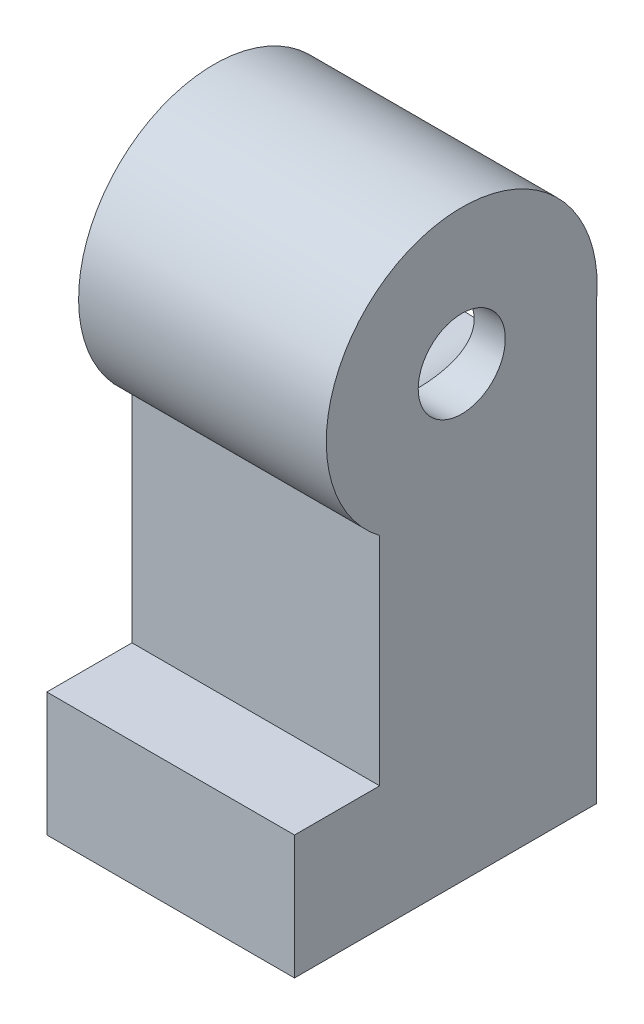
ISO-10303-21;
HEADER;
FILE_DESCRIPTION(('STEP AP214'),'2;1');
FILE_NAME('part.step','',(''),(''),'','','');
FILE_SCHEMA(('AUTOMOTIVE_DESIGN { 1 0 10303 214 1 1 1 1 }'));
ENDSEC;
DATA;
#1=APPLICATION_CONTEXT('core data for automotive mechanical design processes');
#2=APPLICATION_PROTOCOL_DEFINITION('international standard','automotive_design',2000,#1);
#3=PRODUCT_CONTEXT('',#1,'mechanical');
#4=PRODUCT('Part','Part','',(#3));
#5=PRODUCT_RELATED_PRODUCT_CATEGORY('part','',(#4));
#6=PRODUCT_DEFINITION_FORMATION('','',#4);
#7=PRODUCT_DEFINITION_CONTEXT('part definition',#1,'design');
#8=PRODUCT_DEFINITION('design','',#6,#7);
#9=PRODUCT_DEFINITION_SHAPE('','',#8);
#10=(LENGTH_UNIT() NAMED_UNIT(*) SI_UNIT(.MILLI.,.METRE.));
#11=(NAMED_UNIT(*) PLANE_ANGLE_UNIT() SI_UNIT($,.RADIAN.));
#12=(NAMED_UNIT(*) SI_UNIT($,.STERADIAN.) SOLID_ANGLE_UNIT());
#13=UNCERTAINTY_MEASURE_WITH_UNIT(LENGTH_MEASURE(1.E-05),#10,'distance_accuracy_value','');
#14=(GEOMETRIC_REPRESENTATION_CONTEXT(3) GLOBAL_UNCERTAINTY_ASSIGNED_CONTEXT((#13)) GLOBAL_UNIT_ASSIGNED_CONTEXT((#10,
#11,#12)) REPRESENTATION_CONTEXT('',''));
#15=CARTESIAN_POINT('',(0.,0.,0.));
#16=DIRECTION('',(0.,0.,1.));
#17=DIRECTION('',(1.,0.,0.));
#18=AXIS2_PLACEMENT_3D('',#15,#16,#17);
#19=CARTESIAN_POINT('',(6.4,0.,27.8));
#20=DIRECTION('',(0.,0.,-1.));
#21=DIRECTION('',(1.,0.,0.));
#22=AXIS2_PLACEMENT_3D('',#19,#20,#21);
#23=PLANE('',#22);
#24=DIRECTION('',(0.,1.,0.));
#25=VECTOR('',#24,1.);
#26=CARTESIAN_POINT('',(0.,0.,27.8));
#27=LINE('',#26,#25);
#28=CARTESIAN_POINT('',(0.,0.,27.8));
#29=VERTEX_POINT('',#28);
#30=CARTESIAN_POINT('',(0.,3.2,27.8));
#31=VERTEX_POINT('',#30);
#32=EDGE_CURVE('E222',#29,#31,#27,.T.);
#33=ORIENTED_EDGE('',*,*,#32,.F.);
#34=DIRECTION('',(-1.,0.,0.));
#35=VECTOR('',#34,1.);
#36=CARTESIAN_POINT('',(6.4,0.,27.8));
#37=LINE('',#36,#35);
#38=CARTESIAN_POINT('',(6.4,0.,27.8));
#39=VERTEX_POINT('',#38);
#40=EDGE_CURVE('E245',#39,#29,#37,.T.);
#41=ORIENTED_EDGE('',*,*,#40,.F.);
#42=DIRECTION('',(0.,1.,0.));
#43=VECTOR('',#42,1.);
#44=CARTESIAN_POINT('',(6.4,0.,27.8));
#45=LINE('',#44,#43);
#46=CARTESIAN_POINT('',(6.4,3.2,27.8));
#47=VERTEX_POINT('',#46);
#48=EDGE_CURVE('E227',#39,#47,#45,.T.);
#49=ORIENTED_EDGE('',*,*,#48,.T.);
#50=DIRECTION('',(-1.,0.,0.));
#51=VECTOR('',#50,1.);
#52=CARTESIAN_POINT('',(6.4,3.2,27.8));
#53=LINE('',#52,#51);
#54=EDGE_CURVE('E12',#47,#31,#53,.T.);
#55=ORIENTED_EDGE('',*,*,#54,.T.);
#56=EDGE_LOOP('',(#33,#41,#49,#55));
#57=FACE_BOUND('',#56,.T.);
#58=ADVANCED_FACE('F52',(#57),#23,.F.);
#59=CARTESIAN_POINT('',(6.4,3.2,27.8));
#60=DIRECTION('',(0.,-1.,0.));
#61=DIRECTION('',(0.,0.,1.));
#62=AXIS2_PLACEMENT_3D('',#59,#60,#61);
#63=PLANE('',#62);
#64=DIRECTION('',(0.,0.,-1.));
#65=VECTOR('',#64,1.);
#66=CARTESIAN_POINT('',(0.,3.2,27.8));
#67=LINE('',#66,#65);
#68=CARTESIAN_POINT('',(0.,3.2,25.6));
#69=VERTEX_POINT('',#68);
#70=EDGE_CURVE('E214',#31,#69,#67,.T.);
#71=ORIENTED_EDGE('',*,*,#70,.F.);
#72=ORIENTED_EDGE('',*,*,#54,.F.);
#73=DIRECTION('',(0.,0.,-1.));
#74=VECTOR('',#73,1.);
#75=CARTESIAN_POINT('',(6.4,3.2,27.8));
#76=LINE('',#75,#74);
#77=CARTESIAN_POINT('',(6.4,3.2,25.6));
#78=VERTEX_POINT('',#77);
#79=EDGE_CURVE('E272',#47,#78,#76,.T.);
#80=ORIENTED_EDGE('',*,*,#79,.T.);
#81=DIRECTION('',(-1.,0.,0.));
#82=VECTOR('',#81,1.);
#83=CARTESIAN_POINT('',(6.4,3.2,25.6));
#84=LINE('',#83,#82);
#85=EDGE_CURVE('E65',#78,#69,#84,.T.);
#86=ORIENTED_EDGE('',*,*,#85,.T.);
#87=EDGE_LOOP('',(#71,#72,#80,#86));
#88=FACE_BOUND('',#87,.T.);
#89=ADVANCED_FACE('F203',(#88),#63,.F.);
#90=CARTESIAN_POINT('',(6.4,3.2,25.6));
#91=DIRECTION('',(0.,0.,-1.));
#92=DIRECTION('',(0.,-1.,0.));
#93=AXIS2_PLACEMENT_3D('',#90,#91,#92);
#94=PLANE('',#93);
#95=DIRECTION('',(0.,1.,0.));
#96=VECTOR('',#95,1.);
#97=CARTESIAN_POINT('',(0.,3.2,25.6));
#98=LINE('',#97,#96);
#99=CARTESIAN_POINT('',(0.,8.8,25.6));
#100=VERTEX_POINT('',#99);
#101=EDGE_CURVE('E221',#69,#100,#98,.T.);
#102=ORIENTED_EDGE('',*,*,#101,.F.);
#103=ORIENTED_EDGE('',*,*,#85,.F.);
#104=DIRECTION('',(0.,1.,0.));
#105=VECTOR('',#104,1.);
#106=CARTESIAN_POINT('',(6.4,3.2,25.6));
#107=LINE('',#106,#105);
#108=CARTESIAN_POINT('',(6.4,8.8,25.6));
#109=VERTEX_POINT('',#108);
#110=EDGE_CURVE('E259',#78,#109,#107,.T.);
#111=ORIENTED_EDGE('',*,*,#110,.T.);
#112=DIRECTION('',(-1.,0.,0.));
#113=VECTOR('',#112,1.);
#114=CARTESIAN_POINT('',(6.4,8.8,25.6));
#115=LINE('',#114,#113);
#116=EDGE_CURVE('E254',#109,#100,#115,.T.);
#117=ORIENTED_EDGE('',*,*,#116,.T.);
#118=EDGE_LOOP('',(#102,#103,#111,#117));
#119=FACE_BOUND('',#118,.T.);
#120=ADVANCED_FACE('F199',(#119),#94,.F.);
#121=CARTESIAN_POINT('',(6.4,11.5840258618578,23.4788682265105));
#122=DIRECTION('',(-1.,0.,0.));
#123=DIRECTION('',(0.,0.,-1.));
#124=AXIS2_PLACEMENT_3D('',#121,#122,#123);
#125=CYLINDRICAL_SURFACE('',#124,3.5);
#126=DIRECTION('',(-1.,0.,0.));
#127=VECTOR('',#126,1.);
#128=CARTESIAN_POINT('',(6.4,11.2,20.));
#129=LINE('',#128,#127);
#130=CARTESIAN_POINT('',(0.852661081138903,11.2,20.));
#131=VERTEX_POINT('',#130);
#132=CARTESIAN_POINT('',(0.,11.2,20.));
#133=VERTEX_POINT('',#132);
#134=EDGE_CURVE('E250',#131,#133,#129,.T.);
#135=ORIENTED_EDGE('',*,*,#134,.T.);
#136=CARTESIAN_POINT('',(0.,11.5840258618578,23.4788682265105));
#137=DIRECTION('',(-1.,0.,0.));
#138=DIRECTION('',(0.,0.,1.));
#139=AXIS2_PLACEMENT_3D('',#136,#137,#138);
#140=CIRCLE('',#139,3.5);
#141=EDGE_CURVE('E239',#100,#133,#140,.T.);
#142=ORIENTED_EDGE('',*,*,#141,.F.);
#143=ORIENTED_EDGE('',*,*,#116,.F.);
#144=CARTESIAN_POINT('',(6.4,11.5840258618578,23.4788682265105));
#145=DIRECTION('',(-1.,0.,0.));
#146=DIRECTION('',(0.,0.,1.));
#147=AXIS2_PLACEMENT_3D('',#144,#145,#146);
#148=CIRCLE('',#147,3.5);
#149=CARTESIAN_POINT('',(6.4,11.2,20.));
#150=VERTEX_POINT('',#149);
#151=EDGE_CURVE('E276',#109,#150,#148,.T.);
#152=ORIENTED_EDGE('',*,*,#151,.T.);
#153=CARTESIAN_POINT('',(5.5473389188611,11.2,20.));
#154=VERTEX_POINT('',#153);
#155=EDGE_CURVE('E251',#150,#154,#129,.T.);
#156=ORIENTED_EDGE('',*,*,#155,.T.);
#157=CARTESIAN_POINT('',(0.852661081138903,11.2,20.));
#158=CARTESIAN_POINT('',(0.840792293346237,11.2556738277083,19.9938438134975));
#159=CARTESIAN_POINT('',(0.830892766927941,11.3119160095123,19.9889984058087));
#160=CARTESIAN_POINT('',(0.815110303502944,11.4251260777878,19.9820198838566));
#161=CARTESIAN_POINT('',(0.809227320363557,11.4820939559166,19.979886738441));
#162=CARTESIAN_POINT('',(0.80157104908777,11.5961176248204,19.9784262527192));
#163=CARTESIAN_POINT('',(0.799781445972068,11.6531721564266,19.9790877436915));
#164=CARTESIAN_POINT('',(0.800261552975997,11.7671450125878,19.9831957472816));
#165=CARTESIAN_POINT('',(0.802531011672886,11.8240633453604,19.9866420873957));
#166=CARTESIAN_POINT('',(0.815380909087971,11.9940544139057,20.001116349994));
#167=CARTESIAN_POINT('',(0.832000500817748,12.10639939998,20.0162790810086));
#168=CARTESIAN_POINT('',(0.880312547670731,12.3258753161952,20.0565651958183));
#169=CARTESIAN_POINT('',(0.912013416300616,12.4330032990667,20.0816941382362));
#170=CARTESIAN_POINT('',(0.989988504379228,12.6427122302376,20.1409975856636));
#171=CARTESIAN_POINT('',(1.03664120934427,12.7450857404032,20.1754028505256));
#172=CARTESIAN_POINT('',(1.14244402315444,12.9404948285297,20.2507144673552));
#173=CARTESIAN_POINT('',(1.20159765209792,13.0335277653988,20.2916226496546));
#174=CARTESIAN_POINT('',(1.34142019627974,13.2237448020704,20.3846357282459));
#175=CARTESIAN_POINT('',(1.42402381716511,13.3191411164894,20.4374793988586));
#176=CARTESIAN_POINT('',(1.6026286577345,13.4956102104736,20.5451769699699));
#177=CARTESIAN_POINT('',(1.69865991915841,13.5766499219027,20.6000351688464));
#178=CARTESIAN_POINT('',(1.86002813647221,13.6924280478097,20.6846924784101));
#179=CARTESIAN_POINT('',(1.92128804897133,13.7323050685919,20.7153273261498));
#180=CARTESIAN_POINT('',(2.04784784601227,13.8066440389178,20.7747536818376));
#181=CARTESIAN_POINT('',(2.1131490474489,13.8411042102392,20.8035445826317));
#182=CARTESIAN_POINT('',(2.31463157585771,13.9356202222924,20.8852431757694));
#183=CARTESIAN_POINT('',(2.4569681619758,13.9872308836361,20.9338004468208));
#184=CARTESIAN_POINT('',(2.69816643388576,14.0488934090757,20.9938033781543));
#185=CARTESIAN_POINT('',(2.79317022247037,14.0672782999088,21.0123388545372));
#186=CARTESIAN_POINT('',(2.98617258953903,14.092425975245,21.0379130326297));
#187=CARTESIAN_POINT('',(3.08416572381198,14.0992087375294,21.0449714956457));
#188=CARTESIAN_POINT('',(3.28054729705155,14.1006615605423,21.0464725445557));
#189=CARTESIAN_POINT('',(3.37893613355414,14.0953058590704,21.0408882980851));
#190=CARTESIAN_POINT('',(3.57301216932402,14.0728544934742,21.017979545314));
#191=CARTESIAN_POINT('',(3.66869540391411,14.0557424450877,21.000638654782));
#192=CARTESIAN_POINT('',(3.88078763205757,14.0046634203404,20.9506083737128));
#193=CARTESIAN_POINT('',(3.99569201112349,13.967362907782,20.9150153866289));
#194=CARTESIAN_POINT('',(4.21592733276386,13.877638288311,20.8344446136202));
#195=CARTESIAN_POINT('',(4.32123614921084,13.8251803359318,20.7894458882553));
#196=CARTESIAN_POINT('',(4.547718440401,13.6912714191813,20.6826918787694));
#197=CARTESIAN_POINT('',(4.66591506819168,13.6058291996055,20.6196188679842));
#198=CARTESIAN_POINT('',(4.88519572570754,13.4150133540185,20.4938038611688));
#199=CARTESIAN_POINT('',(4.98626798994013,13.3096261289623,20.431062121187));
#200=CARTESIAN_POINT('',(5.16946333606693,13.0794342401466,20.3117645950617));
#201=CARTESIAN_POINT('',(5.25152283052074,12.9545666899694,20.2552298905018));
#202=CARTESIAN_POINT('',(5.35708199023806,12.7548307560407,20.1797318448857));
#203=CARTESIAN_POINT('',(5.3893322261386,12.6862257266232,20.1561281715822));
#204=CARTESIAN_POINT('',(5.44751416759658,12.545274773158,20.1126487843578));
#205=CARTESIAN_POINT('',(5.47344870231844,12.4729305417842,20.0927714021396));
#206=CARTESIAN_POINT('',(5.52849534527345,12.292090667837,20.0494814483499));
#207=CARTESIAN_POINT('',(5.55387766967909,12.1818451350743,20.0284377096837));
#208=CARTESIAN_POINT('',(5.58884557576572,11.9574628249701,19.9970075367504));
#209=CARTESIAN_POINT('',(5.59844568859202,11.8433297259872,19.9866113023433));
#210=CARTESIAN_POINT('',(5.60089727934255,11.6400881888514,19.978186374789));
#211=CARTESIAN_POINT('',(5.59701929540537,11.5511021001347,19.9779086599021));
#212=CARTESIAN_POINT('',(5.58385360655739,11.4185367026676,19.9825019246715));
#213=CARTESIAN_POINT('',(5.57823387307489,11.3744706000077,19.9848713355362));
#214=CARTESIAN_POINT('',(5.56458362295902,11.286826347634,19.9912320995191));
#215=CARTESIAN_POINT('',(5.55655284918177,11.2432482504818,19.9952236256563));
#216=CARTESIAN_POINT('',(5.5473389188611,11.2,20.));
#217=B_SPLINE_CURVE_WITH_KNOTS('',3,(#157,#158,#159,#160,#161,#162,#163,#164,#165,#166,#167,
#168,#169,#170,#171,#172,#173,#174,#175,#176,#177,#178,#179,#180,#181,#182,#183,#184,#185,#186,
#187,#188,#189,#190,#191,#192,#193,#194,#195,#196,#197,#198,#199,#200,#201,#202,#203,#204,#205,
#206,#207,#208,#209,#210,#211,#212,#213,#214,#215,#216),.UNSPECIFIED.,.F.,.F.,(4,2,2,2,2,2,2,2,
2,2,2,2,2,2,2,2,2,2,2,2,2,2,2,2,2,2,2,2,2,4),(0.,0.171723989401013,0.343446006403999,
0.514482389563074,0.685508178907873,1.02745241853051,1.36958764528835,1.72117673045833,
2.0728649507947,2.48177927619536,2.89162355912204,3.12909781536246,3.36664986665492,
3.83943681847953,4.13385152491645,4.42775876449654,4.72229036527191,5.01723327563622,
5.3929901520559,5.76959263754877,6.24394486008456,6.71862168168708,7.19486383484634,
7.4326922845584,7.67041400049624,8.01401878203673,8.35730701902312,8.62368382073456,
8.75705540094371,8.89044121064439),.UNSPECIFIED.);
#218=EDGE_CURVE('E181',#131,#154,#217,.T.);
#219=ORIENTED_EDGE('',*,*,#218,.F.);
#220=EDGE_LOOP('',(#135,#142,#143,#152,#156,#219));
#221=FACE_BOUND('',#220,.T.);
#222=ADVANCED_FACE('F193',(#221),#125,.T.);
#223=CARTESIAN_POINT('',(6.4,11.2,20.));
#224=DIRECTION('',(0.,0.,1.));
#225=DIRECTION('',(0.,1.,0.));
#226=AXIS2_PLACEMENT_3D('',#223,#224,#225);
#227=PLANE('',#226);
#228=ORIENTED_EDGE('',*,*,#155,.F.);
#229=DIRECTION('',(0.,-1.,0.));
#230=VECTOR('',#229,1.);
#231=CARTESIAN_POINT('',(6.4,11.2,20.));
#232=LINE('',#231,#230);
#233=CARTESIAN_POINT('',(6.4,0.,20.));
#234=VERTEX_POINT('',#233);
#235=EDGE_CURVE('E267',#150,#234,#232,.T.);
#236=ORIENTED_EDGE('',*,*,#235,.T.);
#237=DIRECTION('',(-1.,0.,0.));
#238=VECTOR('',#237,1.);
#239=CARTESIAN_POINT('',(6.4,0.,20.));
#240=LINE('',#239,#238);
#241=CARTESIAN_POINT('',(0.,0.,20.));
#242=VERTEX_POINT('',#241);
#243=EDGE_CURVE('E247',#234,#242,#240,.T.);
#244=ORIENTED_EDGE('',*,*,#243,.T.);
#245=DIRECTION('',(0.,-1.,0.));
#246=VECTOR('',#245,1.);
#247=CARTESIAN_POINT('',(0.,11.2,20.));
#248=LINE('',#247,#246);
#249=EDGE_CURVE('E242',#133,#242,#248,.T.);
#250=ORIENTED_EDGE('',*,*,#249,.F.);
#251=ORIENTED_EDGE('',*,*,#134,.F.);
#252=CARTESIAN_POINT('',(3.2,11.7,20.));
#253=DIRECTION('',(0.,0.,-1.));
#254=DIRECTION('',(0.,1.,0.));
#255=AXIS2_PLACEMENT_3D('',#252,#253,#254);
#256=CIRCLE('',#255,2.4);
#257=EDGE_CURVE('E79',#154,#131,#256,.T.);
#258=ORIENTED_EDGE('',*,*,#257,.F.);
#259=EDGE_LOOP('',(#228,#236,#244,#250,#251,#258));
#260=FACE_BOUND('',#259,.T.);
#261=ADVANCED_FACE('F198',(#260),#227,.F.);
#262=CARTESIAN_POINT('',(6.4,0.,20.));
#263=DIRECTION('',(0.,1.,0.));
#264=DIRECTION('',(0.,0.,-1.));
#265=AXIS2_PLACEMENT_3D('',#262,#263,#264);
#266=PLANE('',#265);
#267=DIRECTION('',(1.,0.,0.));
#268=VECTOR('',#267,1.);
#269=CARTESIAN_POINT('',(5.6,0.,24.7));
#270=LINE('',#269,#268);
#271=CARTESIAN_POINT('',(0.8,0.,24.7));
#272=VERTEX_POINT('',#271);
#273=CARTESIAN_POINT('',(5.6,0.,24.7));
#274=VERTEX_POINT('',#273);
#275=EDGE_CURVE('E154',#272,#274,#270,.T.);
#276=ORIENTED_EDGE('',*,*,#275,.T.);
#277=DIRECTION('',(0.,0.,-1.));
#278=VECTOR('',#277,1.);
#279=CARTESIAN_POINT('',(5.6,0.,21.4));
#280=LINE('',#279,#278);
#281=CARTESIAN_POINT('',(5.6,0.,21.4));
#282=VERTEX_POINT('',#281);
#283=EDGE_CURVE('E163',#274,#282,#280,.T.);
#284=ORIENTED_EDGE('',*,*,#283,.T.);
#285=DIRECTION('',(-1.,0.,0.));
#286=VECTOR('',#285,1.);
#287=CARTESIAN_POINT('',(5.6,0.,21.4));
#288=LINE('',#287,#286);
#289=CARTESIAN_POINT('',(0.8,0.,21.4));
#290=VERTEX_POINT('',#289);
#291=EDGE_CURVE('E160',#282,#290,#288,.T.);
#292=ORIENTED_EDGE('',*,*,#291,.T.);
#293=DIRECTION('',(0.,0.,1.));
#294=VECTOR('',#293,1.);
#295=CARTESIAN_POINT('',(0.8,0.,21.4));
#296=LINE('',#295,#294);
#297=EDGE_CURVE('E168',#290,#272,#296,.T.);
#298=ORIENTED_EDGE('',*,*,#297,.T.);
#299=EDGE_LOOP('',(#276,#284,#292,#298));
#300=FACE_BOUND('',#299,.T.);
#301=DIRECTION('',(0.,0.,1.));
#302=VECTOR('',#301,1.);
#303=CARTESIAN_POINT('',(0.,0.,20.));
#304=LINE('',#303,#302);
#305=EDGE_CURVE('E230',#242,#29,#304,.T.);
#306=ORIENTED_EDGE('',*,*,#305,.F.);
#307=ORIENTED_EDGE('',*,*,#243,.F.);
#308=DIRECTION('',(0.,0.,1.));
#309=VECTOR('',#308,1.);
#310=CARTESIAN_POINT('',(6.4,0.,20.));
#311=LINE('',#310,#309);
#312=EDGE_CURVE('E235',#234,#39,#311,.T.);
#313=ORIENTED_EDGE('',*,*,#312,.T.);
#314=ORIENTED_EDGE('',*,*,#40,.T.);
#315=EDGE_LOOP('',(#306,#307,#313,#314));
#316=FACE_BOUND('',#315,.T.);
#317=ADVANCED_FACE('F269',(#300,#316),#266,.F.);
#318=CARTESIAN_POINT('',(6.4,11.5840258618578,23.4788682265105));
#319=DIRECTION('',(1.,0.,0.));
#320=DIRECTION('',(0.,0.,1.));
#321=AXIS2_PLACEMENT_3D('',#318,#319,#320);
#322=PLANE('',#321);
#323=CARTESIAN_POINT('',(6.4,11.5840258618578,23.4788682265105));
#324=DIRECTION('',(-1.,0.,0.));
#325=DIRECTION('',(0.,0.,1.));
#326=AXIS2_PLACEMENT_3D('',#323,#324,#325);
#327=CIRCLE('',#326,1.125);
#328=CARTESIAN_POINT('',(6.4,11.5840258618578,24.6038682265105));
#329=VERTEX_POINT('',#328);
#330=EDGE_CURVE('E188',#329,#329,#327,.T.);
#331=ORIENTED_EDGE('',*,*,#330,.T.);
#332=EDGE_LOOP('',(#331));
#333=FACE_BOUND('',#332,.T.);
#334=ORIENTED_EDGE('',*,*,#48,.F.);
#335=ORIENTED_EDGE('',*,*,#312,.F.);
#336=ORIENTED_EDGE('',*,*,#235,.F.);
#337=ORIENTED_EDGE('',*,*,#151,.F.);
#338=ORIENTED_EDGE('',*,*,#110,.F.);
#339=ORIENTED_EDGE('',*,*,#79,.F.);
#340=EDGE_LOOP('',(#334,#335,#336,#337,#338,#339));
#341=FACE_BOUND('',#340,.T.);
#342=ADVANCED_FACE('F271',(#333,#341),#322,.T.);
#343=CARTESIAN_POINT('',(0.,11.5840258618578,23.4788682265105));
#344=DIRECTION('',(1.,0.,0.));
#345=DIRECTION('',(0.,0.,1.));
#346=AXIS2_PLACEMENT_3D('',#343,#344,#345);
#347=PLANE('',#346);
#348=ORIENTED_EDGE('',*,*,#32,.T.);
#349=ORIENTED_EDGE('',*,*,#70,.T.);
#350=ORIENTED_EDGE('',*,*,#101,.T.);
#351=ORIENTED_EDGE('',*,*,#141,.T.);
#352=ORIENTED_EDGE('',*,*,#249,.T.);
#353=ORIENTED_EDGE('',*,*,#305,.T.);
#354=EDGE_LOOP('',(#348,#349,#350,#351,#352,#353));
#355=FACE_BOUND('',#354,.T.);
#356=ADVANCED_FACE('F228',(#355),#347,.F.);
#357=CARTESIAN_POINT('',(4.4,11.5840258618578,23.4788682265105));
#358=DIRECTION('',(1.,0.,0.));
#359=DIRECTION('',(0.,0.,1.));
#360=AXIS2_PLACEMENT_3D('',#357,#358,#359);
#361=CYLINDRICAL_SURFACE('',#360,1.125);
#362=CARTESIAN_POINT('',(5.59719627883955,11.5840258618578,24.6038682265105));
#363=CARTESIAN_POINT('',(5.59427503568601,11.5236998748837,24.6038650365335));
#364=CARTESIAN_POINT('',(5.58905210179077,11.4633954270214,24.5989867097571));
#365=CARTESIAN_POINT('',(5.5743218710308,11.3447697342202,24.5797814246618));
#366=CARTESIAN_POINT('',(5.5648041855985,11.2864536690491,24.5654315163713));
#367=CARTESIAN_POINT('',(5.54228406811998,11.1736951561263,24.5280421764379));
#368=CARTESIAN_POINT('',(5.52929672890404,11.1192371939856,24.5050402081286));
#369=CARTESIAN_POINT('',(5.50083622660623,11.0151132443282,24.4511860875149));
#370=CARTESIAN_POINT('',(5.48536360297121,10.9654462206436,24.4203356379272));
#371=CARTESIAN_POINT('',(5.4520386656732,10.8686702833571,24.3493421252989));
#372=CARTESIAN_POINT('',(5.43409688153176,10.8219415538139,24.3087230165957));
#373=CARTESIAN_POINT('',(5.39825553474991,10.7357088414585,24.2203528545939));
#374=CARTESIAN_POINT('',(5.38035601851617,10.6962107858982,24.1725960079551));
#375=CARTESIAN_POINT('',(5.34521763397803,10.6230636219626,24.0675358381072));
#376=CARTESIAN_POINT('',(5.32809425961864,10.5899502462235,24.0098172734337));
#377=CARTESIAN_POINT('',(5.29804866437329,10.534150817495,23.8885390395374));
#378=CARTESIAN_POINT('',(5.28512215297769,10.5114541055265,23.8249854214026));
#379=CARTESIAN_POINT('',(5.26631700618769,10.4790740457501,23.6992506968597));
#380=CARTESIAN_POINT('',(5.25994977852162,10.4684807689214,23.6373799634428));
#381=CARTESIAN_POINT('',(5.25352047931649,10.4577847210202,23.5124358953973));
#382=CARTESIAN_POINT('',(5.25345254542066,10.45767219617,23.4493637335516));
#383=CARTESIAN_POINT('',(5.2592269212396,10.4672781823903,23.3321516702075));
#384=CARTESIAN_POINT('',(5.2643413488661,10.475785934956,23.2778695045071));
#385=CARTESIAN_POINT('',(5.27874926023561,10.5004153506345,23.1716429254855));
#386=CARTESIAN_POINT('',(5.28804408308577,10.5165394535782,23.1196992671292));
#387=CARTESIAN_POINT('',(5.31016714836939,10.5564403962688,23.0175633474632));
#388=CARTESIAN_POINT('',(5.32310400655172,10.5804570370807,22.9674892728388));
#389=CARTESIAN_POINT('',(5.35110322632575,10.6352461585047,22.8718397286599));
#390=CARTESIAN_POINT('',(5.36616656494112,10.6660217481871,22.8262663434234));
#391=CARTESIAN_POINT('',(5.39929507882386,10.7382905630724,22.7344095515959));
#392=CARTESIAN_POINT('',(5.41749021836008,10.7806714573843,22.6888690193456));
#393=CARTESIAN_POINT('',(5.45336321422796,10.8724829319528,22.6052610895203));
#394=CARTESIAN_POINT('',(5.47104078922944,10.9219172635145,22.5671976943589));
#395=CARTESIAN_POINT('',(5.50528502811888,11.0298938197844,22.4975858325427));
#396=CARTESIAN_POINT('',(5.52173233805914,11.0887930105403,22.4665275107757));
#397=CARTESIAN_POINT('',(5.55070633543802,11.2119723202044,22.4150792921436));
#398=CARTESIAN_POINT('',(5.56323577909977,11.2762486157807,22.394681888497));
#399=CARTESIAN_POINT('',(5.58237231342718,11.4031758018193,22.3667464010935));
#400=CARTESIAN_POINT('',(5.58935653683527,11.4655801693979,22.3583502718614));
#401=CARTESIAN_POINT('',(5.59836111641309,11.591258526578,22.3521363800897));
#402=CARTESIAN_POINT('',(5.60038411183566,11.6545320357932,22.354312991271));
#403=CARTESIAN_POINT('',(5.59952991305004,11.7746255372717,22.3686193174094));
#404=CARTESIAN_POINT('',(5.59704030805388,11.8315498012826,22.3799196498094));
#405=CARTESIAN_POINT('',(5.58834604163984,11.9427194663538,22.4110218684017));
#406=CARTESIAN_POINT('',(5.58214115103642,11.9969647019288,22.4308242790419));
#407=CARTESIAN_POINT('',(5.56666713397811,12.10219232262,22.4786095459337));
#408=CARTESIAN_POINT('',(5.5573551570658,12.1531164541508,22.506706126305));
#409=CARTESIAN_POINT('',(5.53670746560008,12.2497674361553,22.5701556571529));
#410=CARTESIAN_POINT('',(5.52537098197962,12.2954923006962,22.6055113659846));
#411=CARTESIAN_POINT('',(5.50087785208001,12.3842866806517,22.6857312873225));
#412=CARTESIAN_POINT('',(5.48764815131561,12.4268555406099,22.7311281891098));
#413=CARTESIAN_POINT('',(5.46168375686181,12.5040197628241,22.8284119156251));
#414=CARTESIAN_POINT('',(5.44894927497159,12.5386117439773,22.8803014780286));
#415=CARTESIAN_POINT('',(5.42508777705157,12.6000642633892,22.9915503733329));
#416=CARTESIAN_POINT('',(5.41404059567096,12.6265795985655,23.0511191237613));
#417=CARTESIAN_POINT('',(5.39580201317701,12.6690174451843,23.1744623437716));
#418=CARTESIAN_POINT('',(5.38860754691541,12.6849483798144,23.2382334245553));
#419=CARTESIAN_POINT('',(5.37957648705086,12.7047673604224,23.3635128732865));
#420=CARTESIAN_POINT('',(5.37740783442703,12.7094028928169,23.4248787740563));
#421=CARTESIAN_POINT('',(5.37777988888969,12.7086010452623,23.5475217261634));
#422=CARTESIAN_POINT('',(5.38031939967739,12.7031662240929,23.6087987961126));
#423=CARTESIAN_POINT('',(5.38942483237971,12.6831209082167,23.725692874231));
#424=CARTESIAN_POINT('',(5.39574067475723,12.6690790503203,23.7814291403855));
#425=CARTESIAN_POINT('',(5.41136734023517,12.6328670435783,23.8897460402496));
#426=CARTESIAN_POINT('',(5.42067901428647,12.6106945850262,23.9423257723203));
#427=CARTESIAN_POINT('',(5.44178944182351,12.5574618731686,24.0459885165314));
#428=CARTESIAN_POINT('',(5.45369596682053,12.5259836039807,24.0968343529843));
#429=CARTESIAN_POINT('',(5.47829179345431,12.4554989092288,24.1928062909083));
#430=CARTESIAN_POINT('',(5.49098140263382,12.4164895129781,24.2379301236338));
#431=CARTESIAN_POINT('',(5.51674285951374,12.3284596493027,24.3247721552222));
#432=CARTESIAN_POINT('',(5.52976870919507,12.2788991238743,24.3659593057808));
#433=CARTESIAN_POINT('',(5.5535389551452,12.1730653810064,24.4394968144208));
#434=CARTESIAN_POINT('',(5.564282626037,12.1167900381513,24.4718443638204));
#435=CARTESIAN_POINT('',(5.58186521955255,12.0002051240753,24.5259920896947));
#436=CARTESIAN_POINT('',(5.58877847366114,11.939999715173,24.5479916964591));
#437=CARTESIAN_POINT('',(5.59796539261416,11.8164877238476,24.5814361510914));
#438=CARTESIAN_POINT('',(5.60025232450305,11.7531905439682,24.5929111288778));
#439=CARTESIAN_POINT('',(5.59990121522555,11.6719595979114,24.6005658674204));
#440=CARTESIAN_POINT('',(5.59963107056676,11.6543894823292,24.6018036579469));
#441=CARTESIAN_POINT('',(5.59870464816884,11.6192209203101,24.6034552900255));
#442=CARTESIAN_POINT('',(5.59804838234512,11.6016224747641,24.6038691570015));
#443=CARTESIAN_POINT('',(5.59719627883955,11.5840258618578,24.6038682265105));
#444=B_SPLINE_CURVE_WITH_KNOTS('',3,(#362,#363,#364,#365,#366,#367,#368,#369,#370,#371,#372,
#373,#374,#375,#376,#377,#378,#379,#380,#381,#382,#383,#384,#385,#386,#387,#388,#389,#390,#391,
#392,#393,#394,#395,#396,#397,#398,#399,#400,#401,#402,#403,#404,#405,#406,#407,#408,#409,#410,
#411,#412,#413,#414,#415,#416,#417,#418,#419,#420,#421,#422,#423,#424,#425,#426,#427,#428,#429,
#430,#431,#432,#433,#434,#435,#436,#437,#438,#439,#440,#441,#442,#443),.UNSPECIFIED.,.T.,.F.,(4,
2,2,2,2,2,2,2,2,2,2,2,2,2,2,2,2,2,2,2,2,2,2,2,2,2,2,2,2,2,2,2,2,2,2,2,2,2,2,2,4),(0.,
0.181117030614973,0.36267453310764,0.543454777760868,0.724195835801109,0.916766336242543,
1.1094939938332,1.31454943355957,1.51939457738703,1.70754270685981,1.89551573693542,
2.06030589252598,2.2251488730306,2.3955524806459,2.56603463754919,2.75965142189522,
2.95337156603571,3.15804663184726,3.36257738288515,3.55159412325555,3.74051028947552,
3.91396112082936,4.08742265297981,4.26338275901869,4.43940985130182,4.62944107279057,
4.81955269400829,5.01691528782481,5.21412062948788,5.39787137148979,5.58157543060421,
5.75428470648427,5.92704308293808,6.10920314727741,6.29143521282084,6.48772157920872,
6.68407024101076,6.87646174321314,7.06830073185067,7.12113276636966,7.17396317061705),.UNSPECIFIED.);
#445=CARTESIAN_POINT('',(5.59719627883955,11.5840258618578,24.6038682265105));
#446=VERTEX_POINT('',#445);
#447=EDGE_CURVE('E55',#446,#446,#444,.T.);
#448=ORIENTED_EDGE('',*,*,#447,.F.);
#449=EDGE_LOOP('',(#448));
#450=FACE_BOUND('',#449,.T.);
#451=ORIENTED_EDGE('',*,*,#330,.F.);
#452=EDGE_LOOP('',(#451));
#453=FACE_BOUND('',#452,.T.);
#454=ADVANCED_FACE('F284',(#450,#453),#361,.F.);
#455=CARTESIAN_POINT('',(3.2,11.7,25.));
#456=DIRECTION('',(0.,0.,-1.));
#457=DIRECTION('',(1.,0.,0.));
#458=AXIS2_PLACEMENT_3D('',#455,#456,#457);
#459=CYLINDRICAL_SURFACE('',#458,2.4);
#460=ORIENTED_EDGE('',*,*,#447,.T.);
#461=EDGE_LOOP('',(#460));
#462=FACE_BOUND('',#461,.T.);
#463=CARTESIAN_POINT('',(3.2,11.7,25.));
#464=DIRECTION('',(0.,0.,1.));
#465=DIRECTION('',(1.,0.,0.));
#466=AXIS2_PLACEMENT_3D('',#463,#464,#465);
#467=CIRCLE('',#466,2.4);
#468=CARTESIAN_POINT('',(5.6,11.7,25.));
#469=VERTEX_POINT('',#468);
#470=EDGE_CURVE('E174',#469,#469,#467,.T.);
#471=ORIENTED_EDGE('',*,*,#470,.T.);
#472=EDGE_LOOP('',(#471));
#473=FACE_BOUND('',#472,.T.);
#474=ORIENTED_EDGE('',*,*,#257,.T.);
#475=ORIENTED_EDGE('',*,*,#218,.T.);
#476=EDGE_LOOP('',(#474,#475));
#477=FACE_BOUND('',#476,.T.);
#478=ADVANCED_FACE('F190',(#462,#473,#477),#459,.F.);
#479=CARTESIAN_POINT('',(3.2,11.7,25.));
#480=DIRECTION('',(0.,0.,-1.));
#481=DIRECTION('',(1.,0.,0.));
#482=AXIS2_PLACEMENT_3D('',#479,#480,#481);
#483=PLANE('',#482);
#484=ORIENTED_EDGE('',*,*,#470,.F.);
#485=EDGE_LOOP('',(#484));
#486=FACE_BOUND('',#485,.T.);
#487=ADVANCED_FACE('F293',(#486),#483,.T.);
#488=CARTESIAN_POINT('',(0.8,8.9,21.4));
#489=DIRECTION('',(-1.,0.,0.));
#490=DIRECTION('',(0.,0.,-1.));
#491=AXIS2_PLACEMENT_3D('',#488,#489,#490);
#492=PLANE('',#491);
#493=ORIENTED_EDGE('',*,*,#297,.F.);
#494=DIRECTION('',(0.,-1.,0.));
#495=VECTOR('',#494,1.);
#496=CARTESIAN_POINT('',(0.8,8.9,21.4));
#497=LINE('',#496,#495);
#498=CARTESIAN_POINT('',(0.8,8.9,21.4));
#499=VERTEX_POINT('',#498);
#500=EDGE_CURVE('E159',#499,#290,#497,.T.);
#501=ORIENTED_EDGE('',*,*,#500,.F.);
#502=DIRECTION('',(0.,0.,1.));
#503=VECTOR('',#502,1.);
#504=CARTESIAN_POINT('',(0.8,8.9,21.4));
#505=LINE('',#504,#503);
#506=CARTESIAN_POINT('',(0.8,8.9,24.7));
#507=VERTEX_POINT('',#506);
#508=EDGE_CURVE('E145',#499,#507,#505,.T.);
#509=ORIENTED_EDGE('',*,*,#508,.T.);
#510=DIRECTION('',(0.,-1.,0.));
#511=VECTOR('',#510,1.);
#512=CARTESIAN_POINT('',(0.8,8.9,24.7));
#513=LINE('',#512,#511);
#514=EDGE_CURVE('E72',#507,#272,#513,.T.);
#515=ORIENTED_EDGE('',*,*,#514,.T.);
#516=EDGE_LOOP('',(#493,#501,#509,#515));
#517=FACE_BOUND('',#516,.T.);
#518=ADVANCED_FACE('F158',(#517),#492,.F.);
#519=CARTESIAN_POINT('',(5.6,8.9,21.4));
#520=DIRECTION('',(0.,0.,-1.));
#521=DIRECTION('',(1.,0.,0.));
#522=AXIS2_PLACEMENT_3D('',#519,#520,#521);
#523=PLANE('',#522);
#524=ORIENTED_EDGE('',*,*,#291,.F.);
#525=DIRECTION('',(0.,-1.,0.));
#526=VECTOR('',#525,1.);
#527=CARTESIAN_POINT('',(5.6,8.9,21.4));
#528=LINE('',#527,#526);
#529=CARTESIAN_POINT('',(5.6,8.9,21.4));
#530=VERTEX_POINT('',#529);
#531=EDGE_CURVE('E175',#530,#282,#528,.T.);
#532=ORIENTED_EDGE('',*,*,#531,.F.);
#533=DIRECTION('',(-1.,0.,0.));
#534=VECTOR('',#533,1.);
#535=CARTESIAN_POINT('',(5.6,8.9,21.4));
#536=LINE('',#535,#534);
#537=EDGE_CURVE('E156',#530,#499,#536,.T.);
#538=ORIENTED_EDGE('',*,*,#537,.T.);
#539=ORIENTED_EDGE('',*,*,#500,.T.);
#540=EDGE_LOOP('',(#524,#532,#538,#539));
#541=FACE_BOUND('',#540,.T.);
#542=ADVANCED_FACE('F306',(#541),#523,.F.);
#543=CARTESIAN_POINT('',(5.6,8.9,21.4));
#544=DIRECTION('',(1.,0.,0.));
#545=DIRECTION('',(0.,0.,1.));
#546=AXIS2_PLACEMENT_3D('',#543,#544,#545);
#547=PLANE('',#546);
#548=ORIENTED_EDGE('',*,*,#283,.F.);
#549=DIRECTION('',(0.,-1.,0.));
#550=VECTOR('',#549,1.);
#551=CARTESIAN_POINT('',(5.6,8.9,24.7));
#552=LINE('',#551,#550);
#553=CARTESIAN_POINT('',(5.6,8.9,24.7));
#554=VERTEX_POINT('',#553);
#555=EDGE_CURVE('E155',#554,#274,#552,.T.);
#556=ORIENTED_EDGE('',*,*,#555,.F.);
#557=DIRECTION('',(0.,0.,-1.));
#558=VECTOR('',#557,1.);
#559=CARTESIAN_POINT('',(5.6,8.9,21.4));
#560=LINE('',#559,#558);
#561=EDGE_CURVE('E147',#554,#530,#560,.T.);
#562=ORIENTED_EDGE('',*,*,#561,.T.);
#563=ORIENTED_EDGE('',*,*,#531,.T.);
#564=EDGE_LOOP('',(#548,#556,#562,#563));
#565=FACE_BOUND('',#564,.T.);
#566=ADVANCED_FACE('F311',(#565),#547,.F.);
#567=CARTESIAN_POINT('',(5.6,8.9,24.7));
#568=DIRECTION('',(0.,0.,1.));
#569=DIRECTION('',(-1.,0.,0.));
#570=AXIS2_PLACEMENT_3D('',#567,#568,#569);
#571=PLANE('',#570);
#572=ORIENTED_EDGE('',*,*,#275,.F.);
#573=ORIENTED_EDGE('',*,*,#514,.F.);
#574=DIRECTION('',(1.,0.,0.));
#575=VECTOR('',#574,1.);
#576=CARTESIAN_POINT('',(5.6,8.9,24.7));
#577=LINE('',#576,#575);
#578=EDGE_CURVE('E142',#507,#554,#577,.T.);
#579=ORIENTED_EDGE('',*,*,#578,.T.);
#580=ORIENTED_EDGE('',*,*,#555,.T.);
#581=EDGE_LOOP('',(#572,#573,#579,#580));
#582=FACE_BOUND('',#581,.T.);
#583=ADVANCED_FACE('F152',(#582),#571,.F.);
#584=CARTESIAN_POINT('',(0.,8.9,20.));
#585=DIRECTION('',(0.,1.,0.));
#586=DIRECTION('',(0.,0.,-1.));
#587=AXIS2_PLACEMENT_3D('',#584,#585,#586);
#588=PLANE('',#587);
#589=ORIENTED_EDGE('',*,*,#508,.F.);
#590=ORIENTED_EDGE('',*,*,#537,.F.);
#591=ORIENTED_EDGE('',*,*,#561,.F.);
#592=ORIENTED_EDGE('',*,*,#578,.F.);
#593=EDGE_LOOP('',(#589,#590,#591,#592));
#594=FACE_BOUND('',#593,.T.);
#595=ADVANCED_FACE('F143',(#594),#588,.F.);
#596=CLOSED_SHELL('',(#58,#89,#120,#222,#261,#317,#342,#356,#454,#478,#487,#518,#542,#566,#583,#595));
#597=MANIFOLD_SOLID_BREP('B2',#596);
#598=ADVANCED_BREP_SHAPE_REPRESENTATION('',(#18,#597),#14);
#599=SHAPE_DEFINITION_REPRESENTATION(#9,#598);
ENDSEC;
END-ISO-10303-21;
